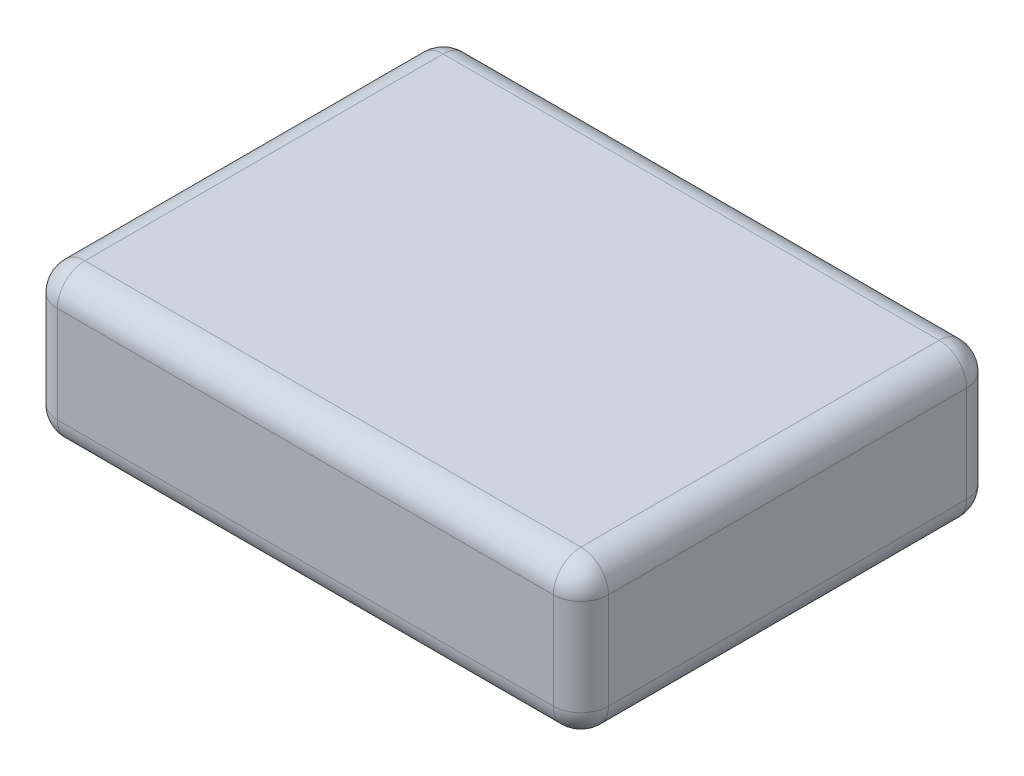
ISO-10303-21;
HEADER;
FILE_DESCRIPTION(('STEP AP214'),'2;1');
FILE_NAME('part.step','',(''),(''),'','','');
FILE_SCHEMA(('AUTOMOTIVE_DESIGN { 1 0 10303 214 1 1 1 1 }'));
ENDSEC;
DATA;
#1=APPLICATION_CONTEXT('core data for automotive mechanical design processes');
#2=APPLICATION_PROTOCOL_DEFINITION('international standard','automotive_design',2000,#1);
#3=PRODUCT_CONTEXT('',#1,'mechanical');
#4=PRODUCT('Part','Part','',(#3));
#5=PRODUCT_RELATED_PRODUCT_CATEGORY('part','',(#4));
#6=PRODUCT_DEFINITION_FORMATION('','',#4);
#7=PRODUCT_DEFINITION_CONTEXT('part definition',#1,'design');
#8=PRODUCT_DEFINITION('design','',#6,#7);
#9=PRODUCT_DEFINITION_SHAPE('','',#8);
#10=(LENGTH_UNIT() NAMED_UNIT(*) SI_UNIT(.MILLI.,.METRE.));
#11=(NAMED_UNIT(*) PLANE_ANGLE_UNIT() SI_UNIT($,.RADIAN.));
#12=(NAMED_UNIT(*) SI_UNIT($,.STERADIAN.) SOLID_ANGLE_UNIT());
#13=UNCERTAINTY_MEASURE_WITH_UNIT(LENGTH_MEASURE(1.E-05),#10,'distance_accuracy_value','');
#14=(GEOMETRIC_REPRESENTATION_CONTEXT(3) GLOBAL_UNCERTAINTY_ASSIGNED_CONTEXT((#13)) GLOBAL_UNIT_ASSIGNED_CONTEXT((#10,
#11,#12)) REPRESENTATION_CONTEXT('',''));
#15=CARTESIAN_POINT('',(0.,0.,0.));
#16=DIRECTION('',(0.,0.,1.));
#17=DIRECTION('',(1.,0.,0.));
#18=AXIS2_PLACEMENT_3D('',#15,#16,#17);
#19=CARTESIAN_POINT('',(0.,11.,0.));
#20=DIRECTION('',(1.,0.,0.));
#21=DIRECTION('',(0.,0.,-1.));
#22=AXIS2_PLACEMENT_3D('',#19,#20,#21);
#23=PLANE('',#22);
#24=DIRECTION('',(0.,0.,1.));
#25=VECTOR('',#24,1.);
#26=CARTESIAN_POINT('',(0.,9.,0.));
#27=LINE('',#26,#25);
#28=CARTESIAN_POINT('',(0.,9.,-2.));
#29=VERTEX_POINT('',#28);
#30=CARTESIAN_POINT('',(0.,9.,-28.));
#31=VERTEX_POINT('',#30);
#32=EDGE_CURVE('E189',#29,#31,#27,.F.);
#33=ORIENTED_EDGE('',*,*,#32,.T.);
#34=DIRECTION('',(0.,-1.,0.));
#35=VECTOR('',#34,1.);
#36=CARTESIAN_POINT('',(0.,11.,-28.));
#37=LINE('',#36,#35);
#38=CARTESIAN_POINT('',(0.,2.,-28.));
#39=VERTEX_POINT('',#38);
#40=EDGE_CURVE('E193',#31,#39,#37,.T.);
#41=ORIENTED_EDGE('',*,*,#40,.T.);
#42=DIRECTION('',(0.,0.,1.));
#43=VECTOR('',#42,1.);
#44=CARTESIAN_POINT('',(0.,2.,0.));
#45=LINE('',#44,#43);
#46=CARTESIAN_POINT('',(0.,2.,-2.));
#47=VERTEX_POINT('',#46);
#48=EDGE_CURVE('E191',#39,#47,#45,.T.);
#49=ORIENTED_EDGE('',*,*,#48,.T.);
#50=DIRECTION('',(0.,-1.,0.));
#51=VECTOR('',#50,1.);
#52=CARTESIAN_POINT('',(0.,11.,-2.));
#53=LINE('',#52,#51);
#54=EDGE_CURVE('E187',#47,#29,#53,.F.);
#55=ORIENTED_EDGE('',*,*,#54,.T.);
#56=EDGE_LOOP('',(#33,#41,#49,#55));
#57=FACE_BOUND('',#56,.T.);
#58=ADVANCED_FACE('F39',(#57),#23,.F.);
#59=CARTESIAN_POINT('',(0.,11.,0.));
#60=DIRECTION('',(0.,0.,-1.));
#61=DIRECTION('',(-1.,0.,0.));
#62=AXIS2_PLACEMENT_3D('',#59,#60,#61);
#63=PLANE('',#62);
#64=DIRECTION('',(1.,0.,0.));
#65=VECTOR('',#64,1.);
#66=CARTESIAN_POINT('',(0.,9.,0.));
#67=LINE('',#66,#65);
#68=CARTESIAN_POINT('',(38.,9.,0.));
#69=VERTEX_POINT('',#68);
#70=CARTESIAN_POINT('',(2.,9.,0.));
#71=VERTEX_POINT('',#70);
#72=EDGE_CURVE('E48',#69,#71,#67,.F.);
#73=ORIENTED_EDGE('',*,*,#72,.T.);
#74=DIRECTION('',(0.,-1.,0.));
#75=VECTOR('',#74,1.);
#76=CARTESIAN_POINT('',(2.,11.,0.));
#77=LINE('',#76,#75);
#78=CARTESIAN_POINT('',(2.,2.,0.));
#79=VERTEX_POINT('',#78);
#80=EDGE_CURVE('E11',#71,#79,#77,.T.);
#81=ORIENTED_EDGE('',*,*,#80,.T.);
#82=DIRECTION('',(1.,0.,0.));
#83=VECTOR('',#82,1.);
#84=CARTESIAN_POINT('',(40.,2.,0.));
#85=LINE('',#84,#83);
#86=CARTESIAN_POINT('',(38.,2.,0.));
#87=VERTEX_POINT('',#86);
#88=EDGE_CURVE('E204',#79,#87,#85,.T.);
#89=ORIENTED_EDGE('',*,*,#88,.T.);
#90=DIRECTION('',(0.,-1.,0.));
#91=VECTOR('',#90,1.);
#92=CARTESIAN_POINT('',(38.,11.,0.));
#93=LINE('',#92,#91);
#94=EDGE_CURVE('E59',#87,#69,#93,.F.);
#95=ORIENTED_EDGE('',*,*,#94,.T.);
#96=EDGE_LOOP('',(#73,#81,#89,#95));
#97=FACE_BOUND('',#96,.T.);
#98=ADVANCED_FACE('F298',(#97),#63,.F.);
#99=CARTESIAN_POINT('',(40.,11.,0.));
#100=DIRECTION('',(-1.,0.,0.));
#101=DIRECTION('',(0.,0.,1.));
#102=AXIS2_PLACEMENT_3D('',#99,#100,#101);
#103=PLANE('',#102);
#104=DIRECTION('',(0.,-1.,0.));
#105=VECTOR('',#104,1.);
#106=CARTESIAN_POINT('',(40.,11.,-2.));
#107=LINE('',#106,#105);
#108=CARTESIAN_POINT('',(40.,9.,-2.));
#109=VERTEX_POINT('',#108);
#110=CARTESIAN_POINT('',(40.,2.,-2.));
#111=VERTEX_POINT('',#110);
#112=EDGE_CURVE('E131',#109,#111,#107,.T.);
#113=ORIENTED_EDGE('',*,*,#112,.T.);
#114=DIRECTION('',(0.,0.,-1.));
#115=VECTOR('',#114,1.);
#116=CARTESIAN_POINT('',(40.,2.,-30.));
#117=LINE('',#116,#115);
#118=CARTESIAN_POINT('',(40.,2.,-28.));
#119=VERTEX_POINT('',#118);
#120=EDGE_CURVE('E167',#111,#119,#117,.T.);
#121=ORIENTED_EDGE('',*,*,#120,.T.);
#122=DIRECTION('',(0.,-1.,0.));
#123=VECTOR('',#122,1.);
#124=CARTESIAN_POINT('',(40.,11.,-28.));
#125=LINE('',#124,#123);
#126=CARTESIAN_POINT('',(40.,9.,-28.));
#127=VERTEX_POINT('',#126);
#128=EDGE_CURVE('E134',#119,#127,#125,.F.);
#129=ORIENTED_EDGE('',*,*,#128,.T.);
#130=DIRECTION('',(0.,0.,-1.));
#131=VECTOR('',#130,1.);
#132=CARTESIAN_POINT('',(40.,9.,0.));
#133=LINE('',#132,#131);
#134=EDGE_CURVE('E126',#127,#109,#133,.F.);
#135=ORIENTED_EDGE('',*,*,#134,.T.);
#136=EDGE_LOOP('',(#113,#121,#129,#135));
#137=FACE_BOUND('',#136,.T.);
#138=ADVANCED_FACE('F128',(#137),#103,.F.);
#139=CARTESIAN_POINT('',(0.,11.,-30.));
#140=DIRECTION('',(0.,0.,1.));
#141=DIRECTION('',(1.,0.,0.));
#142=AXIS2_PLACEMENT_3D('',#139,#140,#141);
#143=PLANE('',#142);
#144=DIRECTION('',(-1.,0.,0.));
#145=VECTOR('',#144,1.);
#146=CARTESIAN_POINT('',(0.,9.,-30.));
#147=LINE('',#146,#145);
#148=CARTESIAN_POINT('',(2.,9.,-30.));
#149=VERTEX_POINT('',#148);
#150=CARTESIAN_POINT('',(38.,9.,-30.));
#151=VERTEX_POINT('',#150);
#152=EDGE_CURVE('E178',#149,#151,#147,.F.);
#153=ORIENTED_EDGE('',*,*,#152,.T.);
#154=DIRECTION('',(0.,-1.,0.));
#155=VECTOR('',#154,1.);
#156=CARTESIAN_POINT('',(38.,11.,-30.));
#157=LINE('',#156,#155);
#158=CARTESIAN_POINT('',(38.,2.,-30.));
#159=VERTEX_POINT('',#158);
#160=EDGE_CURVE('E184',#151,#159,#157,.T.);
#161=ORIENTED_EDGE('',*,*,#160,.T.);
#162=DIRECTION('',(-1.,0.,0.));
#163=VECTOR('',#162,1.);
#164=CARTESIAN_POINT('',(0.,2.,-30.));
#165=LINE('',#164,#163);
#166=CARTESIAN_POINT('',(2.,2.,-30.));
#167=VERTEX_POINT('',#166);
#168=EDGE_CURVE('E182',#159,#167,#165,.T.);
#169=ORIENTED_EDGE('',*,*,#168,.T.);
#170=DIRECTION('',(0.,-1.,0.));
#171=VECTOR('',#170,1.);
#172=CARTESIAN_POINT('',(2.,11.,-30.));
#173=LINE('',#172,#171);
#174=EDGE_CURVE('E180',#167,#149,#173,.F.);
#175=ORIENTED_EDGE('',*,*,#174,.T.);
#176=EDGE_LOOP('',(#153,#161,#169,#175));
#177=FACE_BOUND('',#176,.T.);
#178=ADVANCED_FACE('F281',(#177),#143,.F.);
#179=CARTESIAN_POINT('',(0.,11.,0.));
#180=DIRECTION('',(0.,-1.,0.));
#181=DIRECTION('',(0.,0.,-1.));
#182=AXIS2_PLACEMENT_3D('',#179,#180,#181);
#183=PLANE('',#182);
#184=DIRECTION('',(0.,0.,-1.));
#185=VECTOR('',#184,1.);
#186=CARTESIAN_POINT('',(38.,11.,0.));
#187=LINE('',#186,#185);
#188=CARTESIAN_POINT('',(38.,11.,-2.));
#189=VERTEX_POINT('',#188);
#190=CARTESIAN_POINT('',(38.,11.,-28.));
#191=VERTEX_POINT('',#190);
#192=EDGE_CURVE('E144',#189,#191,#187,.T.);
#193=ORIENTED_EDGE('',*,*,#192,.T.);
#194=DIRECTION('',(-1.,0.,0.));
#195=VECTOR('',#194,1.);
#196=CARTESIAN_POINT('',(0.,11.,-28.));
#197=LINE('',#196,#195);
#198=CARTESIAN_POINT('',(2.,11.,-28.));
#199=VERTEX_POINT('',#198);
#200=EDGE_CURVE('E201',#191,#199,#197,.T.);
#201=ORIENTED_EDGE('',*,*,#200,.T.);
#202=DIRECTION('',(0.,0.,1.));
#203=VECTOR('',#202,1.);
#204=CARTESIAN_POINT('',(2.,11.,0.));
#205=LINE('',#204,#203);
#206=CARTESIAN_POINT('',(2.,11.,-2.));
#207=VERTEX_POINT('',#206);
#208=EDGE_CURVE('E198',#199,#207,#205,.T.);
#209=ORIENTED_EDGE('',*,*,#208,.T.);
#210=DIRECTION('',(1.,0.,0.));
#211=VECTOR('',#210,1.);
#212=CARTESIAN_POINT('',(0.,11.,-2.));
#213=LINE('',#212,#211);
#214=EDGE_CURVE('E196',#207,#189,#213,.T.);
#215=ORIENTED_EDGE('',*,*,#214,.T.);
#216=EDGE_LOOP('',(#193,#201,#209,#215));
#217=FACE_BOUND('',#216,.T.);
#218=ADVANCED_FACE('F268',(#217),#183,.F.);
#219=CARTESIAN_POINT('',(0.,0.,0.));
#220=DIRECTION('',(0.,-1.,0.));
#221=DIRECTION('',(0.,0.,-1.));
#222=AXIS2_PLACEMENT_3D('',#219,#220,#221);
#223=PLANE('',#222);
#224=DIRECTION('',(-1.,0.,0.));
#225=VECTOR('',#224,1.);
#226=CARTESIAN_POINT('',(40.,0.,-28.));
#227=LINE('',#226,#225);
#228=CARTESIAN_POINT('',(2.,0.,-28.));
#229=VERTEX_POINT('',#228);
#230=CARTESIAN_POINT('',(38.,0.,-28.));
#231=VERTEX_POINT('',#230);
#232=EDGE_CURVE('E173',#229,#231,#227,.F.);
#233=ORIENTED_EDGE('',*,*,#232,.T.);
#234=DIRECTION('',(0.,0.,-1.));
#235=VECTOR('',#234,1.);
#236=CARTESIAN_POINT('',(38.,0.,0.));
#237=LINE('',#236,#235);
#238=CARTESIAN_POINT('',(38.,0.,-2.));
#239=VERTEX_POINT('',#238);
#240=EDGE_CURVE('E175',#231,#239,#237,.F.);
#241=ORIENTED_EDGE('',*,*,#240,.T.);
#242=DIRECTION('',(1.,0.,0.));
#243=VECTOR('',#242,1.);
#244=CARTESIAN_POINT('',(0.,0.,-2.));
#245=LINE('',#244,#243);
#246=CARTESIAN_POINT('',(2.,0.,-2.));
#247=VERTEX_POINT('',#246);
#248=EDGE_CURVE('E169',#239,#247,#245,.F.);
#249=ORIENTED_EDGE('',*,*,#248,.T.);
#250=DIRECTION('',(0.,0.,1.));
#251=VECTOR('',#250,1.);
#252=CARTESIAN_POINT('',(2.,0.,-30.));
#253=LINE('',#252,#251);
#254=EDGE_CURVE('E171',#247,#229,#253,.F.);
#255=ORIENTED_EDGE('',*,*,#254,.T.);
#256=EDGE_LOOP('',(#233,#241,#249,#255));
#257=FACE_BOUND('',#256,.T.);
#258=ADVANCED_FACE('F484',(#257),#223,.T.);
#259=CARTESIAN_POINT('',(2.,9.,0.));
#260=DIRECTION('',(0.,0.,1.));
#261=DIRECTION('',(1.,0.,0.));
#262=AXIS2_PLACEMENT_3D('',#259,#260,#261);
#263=CYLINDRICAL_SURFACE('',#262,2.);
#264=CARTESIAN_POINT('',(2.,9.,-2.));
#265=DIRECTION('',(0.,0.,1.));
#266=DIRECTION('',(1.,0.,0.));
#267=AXIS2_PLACEMENT_3D('',#264,#265,#266);
#268=CIRCLE('',#267,2.);
#269=EDGE_CURVE('E43',#207,#29,#268,.T.);
#270=ORIENTED_EDGE('',*,*,#269,.F.);
#271=ORIENTED_EDGE('',*,*,#208,.F.);
#272=CARTESIAN_POINT('',(2.,9.,-28.));
#273=DIRECTION('',(0.,0.,-1.));
#274=DIRECTION('',(-1.,0.,0.));
#275=AXIS2_PLACEMENT_3D('',#272,#273,#274);
#276=CIRCLE('',#275,2.);
#277=EDGE_CURVE('E164',#31,#199,#276,.T.);
#278=ORIENTED_EDGE('',*,*,#277,.F.);
#279=ORIENTED_EDGE('',*,*,#32,.F.);
#280=EDGE_LOOP('',(#270,#271,#278,#279));
#281=FACE_BOUND('',#280,.T.);
#282=ADVANCED_FACE('F41',(#281),#263,.T.);
#283=CARTESIAN_POINT('',(2.,9.,-2.));
#284=DIRECTION('',(0.,0.,1.));
#285=DIRECTION('',(1.,0.,0.));
#286=AXIS2_PLACEMENT_3D('',#283,#284,#285);
#287=SPHERICAL_SURFACE('',#286,2.);
#288=CARTESIAN_POINT('',(2.,9.,-2.));
#289=DIRECTION('',(-1.,0.,0.));
#290=DIRECTION('',(0.,0.,1.));
#291=AXIS2_PLACEMENT_3D('',#288,#289,#290);
#292=CIRCLE('',#291,2.);
#293=EDGE_CURVE('E249',#207,#71,#292,.F.);
#294=ORIENTED_EDGE('',*,*,#293,.F.);
#295=ORIENTED_EDGE('',*,*,#269,.T.);
#296=CARTESIAN_POINT('',(2.,9.,-2.));
#297=DIRECTION('',(0.,1.,0.));
#298=DIRECTION('',(0.,0.,1.));
#299=AXIS2_PLACEMENT_3D('',#296,#297,#298);
#300=CIRCLE('',#299,2.);
#301=EDGE_CURVE('E251',#71,#29,#300,.F.);
#302=ORIENTED_EDGE('',*,*,#301,.F.);
#303=EDGE_LOOP('',(#294,#295,#302));
#304=FACE_BOUND('',#303,.T.);
#305=ADVANCED_FACE('F291',(#304),#287,.T.);
#306=CARTESIAN_POINT('',(2.,9.,-28.));
#307=DIRECTION('',(0.,0.,1.));
#308=DIRECTION('',(1.,0.,0.));
#309=AXIS2_PLACEMENT_3D('',#306,#307,#308);
#310=SPHERICAL_SURFACE('',#309,2.);
#311=CARTESIAN_POINT('',(2.,9.,-28.));
#312=DIRECTION('',(0.,1.,0.));
#313=DIRECTION('',(0.,0.,1.));
#314=AXIS2_PLACEMENT_3D('',#311,#312,#313);
#315=CIRCLE('',#314,2.);
#316=EDGE_CURVE('E244',#31,#149,#315,.F.);
#317=ORIENTED_EDGE('',*,*,#316,.F.);
#318=ORIENTED_EDGE('',*,*,#277,.T.);
#319=CARTESIAN_POINT('',(2.,9.,-28.));
#320=DIRECTION('',(-1.,0.,0.));
#321=DIRECTION('',(0.,0.,1.));
#322=AXIS2_PLACEMENT_3D('',#319,#320,#321);
#323=CIRCLE('',#322,2.);
#324=EDGE_CURVE('E247',#149,#199,#323,.F.);
#325=ORIENTED_EDGE('',*,*,#324,.F.);
#326=EDGE_LOOP('',(#317,#318,#325));
#327=FACE_BOUND('',#326,.T.);
#328=ADVANCED_FACE('F259',(#327),#310,.T.);
#329=CARTESIAN_POINT('',(2.,11.,-2.));
#330=DIRECTION('',(0.,-1.,0.));
#331=DIRECTION('',(0.,0.,-1.));
#332=AXIS2_PLACEMENT_3D('',#329,#330,#331);
#333=CYLINDRICAL_SURFACE('',#332,2.);
#334=ORIENTED_EDGE('',*,*,#301,.T.);
#335=ORIENTED_EDGE('',*,*,#54,.F.);
#336=CARTESIAN_POINT('',(2.,2.,-2.));
#337=DIRECTION('',(0.,-1.,0.));
#338=DIRECTION('',(0.,0.,-1.));
#339=AXIS2_PLACEMENT_3D('',#336,#337,#338);
#340=CIRCLE('',#339,2.);
#341=EDGE_CURVE('E238',#79,#47,#340,.T.);
#342=ORIENTED_EDGE('',*,*,#341,.F.);
#343=ORIENTED_EDGE('',*,*,#80,.F.);
#344=EDGE_LOOP('',(#334,#335,#342,#343));
#345=FACE_BOUND('',#344,.T.);
#346=ADVANCED_FACE('F295',(#345),#333,.T.);
#347=CARTESIAN_POINT('',(0.,9.,-2.));
#348=DIRECTION('',(1.,0.,0.));
#349=DIRECTION('',(0.,0.,-1.));
#350=AXIS2_PLACEMENT_3D('',#347,#348,#349);
#351=CYLINDRICAL_SURFACE('',#350,2.);
#352=ORIENTED_EDGE('',*,*,#293,.T.);
#353=ORIENTED_EDGE('',*,*,#72,.F.);
#354=CARTESIAN_POINT('',(38.,9.,-2.));
#355=DIRECTION('',(1.,0.,0.));
#356=DIRECTION('',(0.,0.,-1.));
#357=AXIS2_PLACEMENT_3D('',#354,#355,#356);
#358=CIRCLE('',#357,2.);
#359=EDGE_CURVE('E148',#189,#69,#358,.T.);
#360=ORIENTED_EDGE('',*,*,#359,.F.);
#361=ORIENTED_EDGE('',*,*,#214,.F.);
#362=EDGE_LOOP('',(#352,#353,#360,#361));
#363=FACE_BOUND('',#362,.T.);
#364=ADVANCED_FACE('F448',(#363),#351,.T.);
#365=CARTESIAN_POINT('',(38.,9.,0.));
#366=DIRECTION('',(0.,0.,-1.));
#367=DIRECTION('',(-1.,0.,0.));
#368=AXIS2_PLACEMENT_3D('',#365,#366,#367);
#369=CYLINDRICAL_SURFACE('',#368,2.);
#370=CARTESIAN_POINT('',(38.,9.,-28.));
#371=DIRECTION('',(0.,0.,-1.));
#372=DIRECTION('',(-1.,0.,0.));
#373=AXIS2_PLACEMENT_3D('',#370,#371,#372);
#374=CIRCLE('',#373,2.);
#375=EDGE_CURVE('E149',#191,#127,#374,.T.);
#376=ORIENTED_EDGE('',*,*,#375,.F.);
#377=ORIENTED_EDGE('',*,*,#192,.F.);
#378=CARTESIAN_POINT('',(38.,9.,-2.));
#379=DIRECTION('',(0.,0.,1.));
#380=DIRECTION('',(1.,0.,0.));
#381=AXIS2_PLACEMENT_3D('',#378,#379,#380);
#382=CIRCLE('',#381,2.);
#383=EDGE_CURVE('E141',#109,#189,#382,.T.);
#384=ORIENTED_EDGE('',*,*,#383,.F.);
#385=ORIENTED_EDGE('',*,*,#134,.F.);
#386=EDGE_LOOP('',(#376,#377,#384,#385));
#387=FACE_BOUND('',#386,.T.);
#388=ADVANCED_FACE('F143',(#387),#369,.T.);
#389=CARTESIAN_POINT('',(0.,9.,-28.));
#390=DIRECTION('',(-1.,0.,0.));
#391=DIRECTION('',(0.,0.,1.));
#392=AXIS2_PLACEMENT_3D('',#389,#390,#391);
#393=CYLINDRICAL_SURFACE('',#392,2.);
#394=ORIENTED_EDGE('',*,*,#324,.T.);
#395=ORIENTED_EDGE('',*,*,#200,.F.);
#396=CARTESIAN_POINT('',(38.,9.,-28.));
#397=DIRECTION('',(1.,0.,0.));
#398=DIRECTION('',(0.,0.,-1.));
#399=AXIS2_PLACEMENT_3D('',#396,#397,#398);
#400=CIRCLE('',#399,2.);
#401=EDGE_CURVE('E233',#151,#191,#400,.T.);
#402=ORIENTED_EDGE('',*,*,#401,.F.);
#403=ORIENTED_EDGE('',*,*,#152,.F.);
#404=EDGE_LOOP('',(#394,#395,#402,#403));
#405=FACE_BOUND('',#404,.T.);
#406=ADVANCED_FACE('F271',(#405),#393,.T.);
#407=CARTESIAN_POINT('',(2.,11.,-28.));
#408=DIRECTION('',(0.,-1.,0.));
#409=DIRECTION('',(0.,0.,-1.));
#410=AXIS2_PLACEMENT_3D('',#407,#408,#409);
#411=CYLINDRICAL_SURFACE('',#410,2.);
#412=ORIENTED_EDGE('',*,*,#316,.T.);
#413=ORIENTED_EDGE('',*,*,#174,.F.);
#414=CARTESIAN_POINT('',(2.,2.,-28.));
#415=DIRECTION('',(0.,-1.,0.));
#416=DIRECTION('',(0.,0.,-1.));
#417=AXIS2_PLACEMENT_3D('',#414,#415,#416);
#418=CIRCLE('',#417,2.);
#419=EDGE_CURVE('E230',#39,#167,#418,.T.);
#420=ORIENTED_EDGE('',*,*,#419,.F.);
#421=ORIENTED_EDGE('',*,*,#40,.F.);
#422=EDGE_LOOP('',(#412,#413,#420,#421));
#423=FACE_BOUND('',#422,.T.);
#424=ADVANCED_FACE('F285',(#423),#411,.T.);
#425=CARTESIAN_POINT('',(2.,2.,0.));
#426=DIRECTION('',(0.,0.,-1.));
#427=DIRECTION('',(-1.,0.,0.));
#428=AXIS2_PLACEMENT_3D('',#425,#426,#427);
#429=CYLINDRICAL_SURFACE('',#428,2.);
#430=CARTESIAN_POINT('',(2.,2.,-2.));
#431=DIRECTION('',(0.,0.,1.));
#432=DIRECTION('',(1.,0.,0.));
#433=AXIS2_PLACEMENT_3D('',#430,#431,#432);
#434=CIRCLE('',#433,2.);
#435=EDGE_CURVE('E241',#47,#247,#434,.T.);
#436=ORIENTED_EDGE('',*,*,#435,.F.);
#437=ORIENTED_EDGE('',*,*,#48,.F.);
#438=CARTESIAN_POINT('',(2.,2.,-28.));
#439=DIRECTION('',(0.,0.,-1.));
#440=DIRECTION('',(-1.,0.,0.));
#441=AXIS2_PLACEMENT_3D('',#438,#439,#440);
#442=CIRCLE('',#441,2.);
#443=EDGE_CURVE('E228',#229,#39,#442,.T.);
#444=ORIENTED_EDGE('',*,*,#443,.F.);
#445=ORIENTED_EDGE('',*,*,#254,.F.);
#446=EDGE_LOOP('',(#436,#437,#444,#445));
#447=FACE_BOUND('',#446,.T.);
#448=ADVANCED_FACE('F323',(#447),#429,.T.);
#449=CARTESIAN_POINT('',(2.,2.,-2.));
#450=DIRECTION('',(0.,0.,1.));
#451=DIRECTION('',(1.,0.,0.));
#452=AXIS2_PLACEMENT_3D('',#449,#450,#451);
#453=SPHERICAL_SURFACE('',#452,2.);
#454=ORIENTED_EDGE('',*,*,#341,.T.);
#455=ORIENTED_EDGE('',*,*,#435,.T.);
#456=CARTESIAN_POINT('',(2.,2.,-2.));
#457=DIRECTION('',(-1.,0.,0.));
#458=DIRECTION('',(0.,0.,1.));
#459=AXIS2_PLACEMENT_3D('',#456,#457,#458);
#460=CIRCLE('',#459,2.);
#461=EDGE_CURVE('E155',#79,#247,#460,.F.);
#462=ORIENTED_EDGE('',*,*,#461,.F.);
#463=EDGE_LOOP('',(#454,#455,#462));
#464=FACE_BOUND('',#463,.T.);
#465=ADVANCED_FACE('F325',(#464),#453,.T.);
#466=CARTESIAN_POINT('',(38.,9.,-2.));
#467=DIRECTION('',(0.,0.,1.));
#468=DIRECTION('',(1.,0.,0.));
#469=AXIS2_PLACEMENT_3D('',#466,#467,#468);
#470=SPHERICAL_SURFACE('',#469,2.);
#471=ORIENTED_EDGE('',*,*,#383,.T.);
#472=ORIENTED_EDGE('',*,*,#359,.T.);
#473=CARTESIAN_POINT('',(38.,9.,-2.));
#474=DIRECTION('',(0.,1.,0.));
#475=DIRECTION('',(0.,0.,1.));
#476=AXIS2_PLACEMENT_3D('',#473,#474,#475);
#477=CIRCLE('',#476,2.);
#478=EDGE_CURVE('E152',#109,#69,#477,.F.);
#479=ORIENTED_EDGE('',*,*,#478,.F.);
#480=EDGE_LOOP('',(#471,#472,#479));
#481=FACE_BOUND('',#480,.T.);
#482=ADVANCED_FACE('F153',(#481),#470,.T.);
#483=CARTESIAN_POINT('',(38.,9.,-28.));
#484=DIRECTION('',(0.,0.,1.));
#485=DIRECTION('',(1.,0.,0.));
#486=AXIS2_PLACEMENT_3D('',#483,#484,#485);
#487=SPHERICAL_SURFACE('',#486,2.);
#488=ORIENTED_EDGE('',*,*,#401,.T.);
#489=ORIENTED_EDGE('',*,*,#375,.T.);
#490=CARTESIAN_POINT('',(38.,9.,-28.));
#491=DIRECTION('',(0.,1.,0.));
#492=DIRECTION('',(0.,0.,1.));
#493=AXIS2_PLACEMENT_3D('',#490,#491,#492);
#494=CIRCLE('',#493,2.);
#495=EDGE_CURVE('E156',#151,#127,#494,.F.);
#496=ORIENTED_EDGE('',*,*,#495,.F.);
#497=EDGE_LOOP('',(#488,#489,#496));
#498=FACE_BOUND('',#497,.T.);
#499=ADVANCED_FACE('F274',(#498),#487,.T.);
#500=CARTESIAN_POINT('',(2.,2.,-28.));
#501=DIRECTION('',(0.,0.,1.));
#502=DIRECTION('',(1.,0.,0.));
#503=AXIS2_PLACEMENT_3D('',#500,#501,#502);
#504=SPHERICAL_SURFACE('',#503,2.);
#505=ORIENTED_EDGE('',*,*,#443,.T.);
#506=ORIENTED_EDGE('',*,*,#419,.T.);
#507=CARTESIAN_POINT('',(2.,2.,-28.));
#508=DIRECTION('',(-1.,0.,0.));
#509=DIRECTION('',(0.,0.,1.));
#510=AXIS2_PLACEMENT_3D('',#507,#508,#509);
#511=CIRCLE('',#510,2.);
#512=EDGE_CURVE('E221',#229,#167,#511,.F.);
#513=ORIENTED_EDGE('',*,*,#512,.F.);
#514=EDGE_LOOP('',(#505,#506,#513));
#515=FACE_BOUND('',#514,.T.);
#516=ADVANCED_FACE('F319',(#515),#504,.T.);
#517=CARTESIAN_POINT('',(0.,2.,-2.));
#518=DIRECTION('',(-1.,0.,0.));
#519=DIRECTION('',(0.,0.,1.));
#520=AXIS2_PLACEMENT_3D('',#517,#518,#519);
#521=CYLINDRICAL_SURFACE('',#520,2.);
#522=ORIENTED_EDGE('',*,*,#461,.T.);
#523=ORIENTED_EDGE('',*,*,#248,.F.);
#524=CARTESIAN_POINT('',(38.,2.,-2.));
#525=DIRECTION('',(1.,0.,0.));
#526=DIRECTION('',(0.,0.,-1.));
#527=AXIS2_PLACEMENT_3D('',#524,#525,#526);
#528=CIRCLE('',#527,2.);
#529=EDGE_CURVE('E218',#87,#239,#528,.T.);
#530=ORIENTED_EDGE('',*,*,#529,.F.);
#531=ORIENTED_EDGE('',*,*,#88,.F.);
#532=EDGE_LOOP('',(#522,#523,#530,#531));
#533=FACE_BOUND('',#532,.T.);
#534=ADVANCED_FACE('F303',(#533),#521,.T.);
#535=CARTESIAN_POINT('',(38.,11.,-2.));
#536=DIRECTION('',(0.,-1.,0.));
#537=DIRECTION('',(0.,0.,-1.));
#538=AXIS2_PLACEMENT_3D('',#535,#536,#537);
#539=CYLINDRICAL_SURFACE('',#538,2.);
#540=ORIENTED_EDGE('',*,*,#478,.T.);
#541=ORIENTED_EDGE('',*,*,#94,.F.);
#542=CARTESIAN_POINT('',(38.,2.,-2.));
#543=DIRECTION('',(0.,-1.,0.));
#544=DIRECTION('',(0.,0.,-1.));
#545=AXIS2_PLACEMENT_3D('',#542,#543,#544);
#546=CIRCLE('',#545,2.);
#547=EDGE_CURVE('E160',#111,#87,#546,.T.);
#548=ORIENTED_EDGE('',*,*,#547,.F.);
#549=ORIENTED_EDGE('',*,*,#112,.F.);
#550=EDGE_LOOP('',(#540,#541,#548,#549));
#551=FACE_BOUND('',#550,.T.);
#552=ADVANCED_FACE('F158',(#551),#539,.T.);
#553=CARTESIAN_POINT('',(38.,11.,-28.));
#554=DIRECTION('',(0.,-1.,0.));
#555=DIRECTION('',(0.,0.,-1.));
#556=AXIS2_PLACEMENT_3D('',#553,#554,#555);
#557=CYLINDRICAL_SURFACE('',#556,2.);
#558=ORIENTED_EDGE('',*,*,#495,.T.);
#559=ORIENTED_EDGE('',*,*,#128,.F.);
#560=CARTESIAN_POINT('',(38.,2.,-28.));
#561=DIRECTION('',(0.,-1.,0.));
#562=DIRECTION('',(0.,0.,-1.));
#563=AXIS2_PLACEMENT_3D('',#560,#561,#562);
#564=CIRCLE('',#563,2.);
#565=EDGE_CURVE('E214',#159,#119,#564,.T.);
#566=ORIENTED_EDGE('',*,*,#565,.F.);
#567=ORIENTED_EDGE('',*,*,#160,.F.);
#568=EDGE_LOOP('',(#558,#559,#566,#567));
#569=FACE_BOUND('',#568,.T.);
#570=ADVANCED_FACE('F278',(#569),#557,.T.);
#571=CARTESIAN_POINT('',(0.,2.,-28.));
#572=DIRECTION('',(1.,0.,0.));
#573=DIRECTION('',(0.,0.,-1.));
#574=AXIS2_PLACEMENT_3D('',#571,#572,#573);
#575=CYLINDRICAL_SURFACE('',#574,2.);
#576=ORIENTED_EDGE('',*,*,#512,.T.);
#577=ORIENTED_EDGE('',*,*,#168,.F.);
#578=CARTESIAN_POINT('',(38.,2.,-28.));
#579=DIRECTION('',(1.,0.,0.));
#580=DIRECTION('',(0.,0.,-1.));
#581=AXIS2_PLACEMENT_3D('',#578,#579,#580);
#582=CIRCLE('',#581,2.);
#583=EDGE_CURVE('E212',#231,#159,#582,.T.);
#584=ORIENTED_EDGE('',*,*,#583,.F.);
#585=ORIENTED_EDGE('',*,*,#232,.F.);
#586=EDGE_LOOP('',(#576,#577,#584,#585));
#587=FACE_BOUND('',#586,.T.);
#588=ADVANCED_FACE('F316',(#587),#575,.T.);
#589=CARTESIAN_POINT('',(38.,2.,-2.));
#590=DIRECTION('',(0.,0.,1.));
#591=DIRECTION('',(1.,0.,0.));
#592=AXIS2_PLACEMENT_3D('',#589,#590,#591);
#593=SPHERICAL_SURFACE('',#592,2.);
#594=ORIENTED_EDGE('',*,*,#547,.T.);
#595=ORIENTED_EDGE('',*,*,#529,.T.);
#596=CARTESIAN_POINT('',(38.,2.,-2.));
#597=DIRECTION('',(0.,0.,1.));
#598=DIRECTION('',(1.,0.,0.));
#599=AXIS2_PLACEMENT_3D('',#596,#597,#598);
#600=CIRCLE('',#599,2.);
#601=EDGE_CURVE('E210',#111,#239,#600,.F.);
#602=ORIENTED_EDGE('',*,*,#601,.F.);
#603=EDGE_LOOP('',(#594,#595,#602));
#604=FACE_BOUND('',#603,.T.);
#605=ADVANCED_FACE('F305',(#604),#593,.T.);
#606=CARTESIAN_POINT('',(38.,2.,-28.));
#607=DIRECTION('',(0.,0.,1.));
#608=DIRECTION('',(1.,0.,0.));
#609=AXIS2_PLACEMENT_3D('',#606,#607,#608);
#610=SPHERICAL_SURFACE('',#609,2.);
#611=ORIENTED_EDGE('',*,*,#583,.T.);
#612=ORIENTED_EDGE('',*,*,#565,.T.);
#613=CARTESIAN_POINT('',(38.,2.,-28.));
#614=DIRECTION('',(0.,0.,-1.));
#615=DIRECTION('',(-1.,0.,0.));
#616=AXIS2_PLACEMENT_3D('',#613,#614,#615);
#617=CIRCLE('',#616,2.);
#618=EDGE_CURVE('E208',#231,#119,#617,.F.);
#619=ORIENTED_EDGE('',*,*,#618,.F.);
#620=EDGE_LOOP('',(#611,#612,#619));
#621=FACE_BOUND('',#620,.T.);
#622=ADVANCED_FACE('F312',(#621),#610,.T.);
#623=CARTESIAN_POINT('',(38.,2.,0.));
#624=DIRECTION('',(0.,0.,1.));
#625=DIRECTION('',(1.,0.,0.));
#626=AXIS2_PLACEMENT_3D('',#623,#624,#625);
#627=CYLINDRICAL_SURFACE('',#626,2.);
#628=ORIENTED_EDGE('',*,*,#601,.T.);
#629=ORIENTED_EDGE('',*,*,#240,.F.);
#630=ORIENTED_EDGE('',*,*,#618,.T.);
#631=ORIENTED_EDGE('',*,*,#120,.F.);
#632=EDGE_LOOP('',(#628,#629,#630,#631));
#633=FACE_BOUND('',#632,.T.);
#634=ADVANCED_FACE('F309',(#633),#627,.T.);
#635=CLOSED_SHELL('',(#58,#98,#138,#178,#218,#258,#282,#305,#328,#346,#364,#388,#406,#424,#448,
#465,#482,#499,#516,#534,#552,#570,#588,#605,#622,#634));
#636=MANIFOLD_SOLID_BREP('B2',#635);
#637=ADVANCED_BREP_SHAPE_REPRESENTATION('',(#18,#636),#14);
#638=SHAPE_DEFINITION_REPRESENTATION(#9,#637);
ENDSEC;
END-ISO-10303-21;
